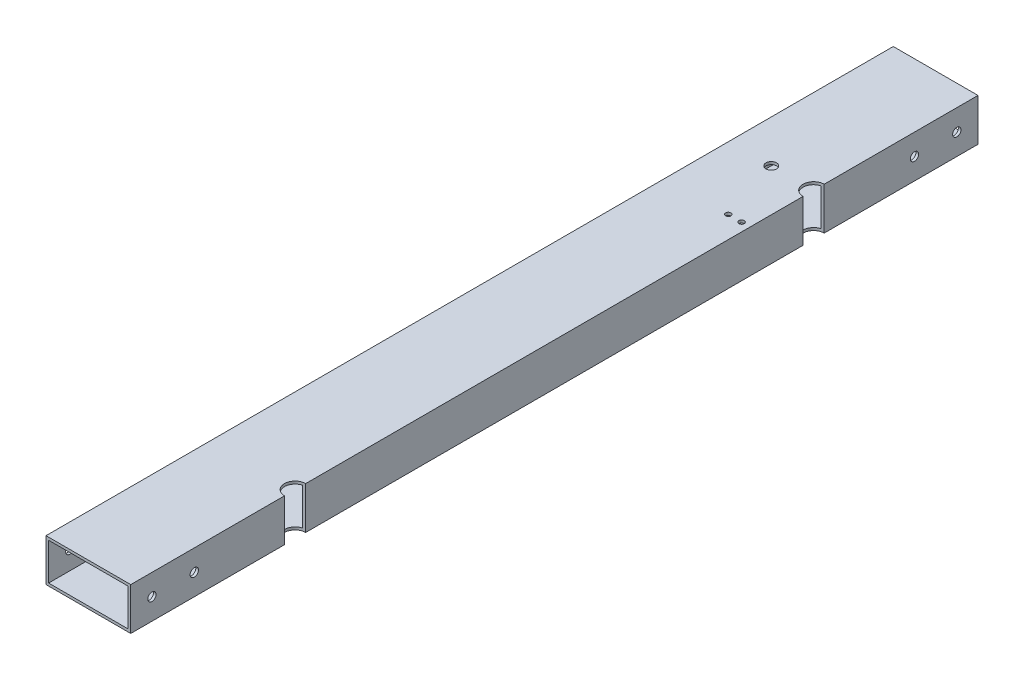
ISO-10303-21;
HEADER;
FILE_DESCRIPTION(('STEP AP214'),'2;1');
FILE_NAME('part.step','',(''),(''),'','','');
FILE_SCHEMA(('AUTOMOTIVE_DESIGN { 1 0 10303 214 1 1 1 1 }'));
ENDSEC;
DATA;
#1=APPLICATION_CONTEXT('core data for automotive mechanical design processes');
#2=APPLICATION_PROTOCOL_DEFINITION('international standard','automotive_design',2000,#1);
#3=PRODUCT_CONTEXT('',#1,'mechanical');
#4=PRODUCT('Part','Part','',(#3));
#5=PRODUCT_RELATED_PRODUCT_CATEGORY('part','',(#4));
#6=PRODUCT_DEFINITION_FORMATION('','',#4);
#7=PRODUCT_DEFINITION_CONTEXT('part definition',#1,'design');
#8=PRODUCT_DEFINITION('design','',#6,#7);
#9=PRODUCT_DEFINITION_SHAPE('','',#8);
#10=(LENGTH_UNIT() NAMED_UNIT(*) SI_UNIT(.MILLI.,.METRE.));
#11=(NAMED_UNIT(*) PLANE_ANGLE_UNIT() SI_UNIT($,.RADIAN.));
#12=(NAMED_UNIT(*) SI_UNIT($,.STERADIAN.) SOLID_ANGLE_UNIT());
#13=UNCERTAINTY_MEASURE_WITH_UNIT(LENGTH_MEASURE(1.E-05),#10,'distance_accuracy_value','');
#14=(GEOMETRIC_REPRESENTATION_CONTEXT(3) GLOBAL_UNCERTAINTY_ASSIGNED_CONTEXT((#13)) GLOBAL_UNIT_ASSIGNED_CONTEXT((#10,
#11,#12)) REPRESENTATION_CONTEXT('',''));
#15=CARTESIAN_POINT('',(0.,0.,0.));
#16=DIRECTION('',(0.,0.,1.));
#17=DIRECTION('',(1.,0.,0.));
#18=AXIS2_PLACEMENT_3D('',#15,#16,#17);
#19=CARTESIAN_POINT('',(25.4,-12.7,254.000000508));
#20=DIRECTION('',(-1.,0.,0.));
#21=DIRECTION('',(0.,0.,1.));
#22=AXIS2_PLACEMENT_3D('',#19,#20,#21);
#23=PLANE('',#22);
#24=CARTESIAN_POINT('',(25.4,1.33226762955019E-12,215.900000508));
#25=DIRECTION('',(1.,0.,0.));
#26=DIRECTION('',(0.,0.,-1.));
#27=AXIS2_PLACEMENT_3D('',#24,#25,#26);
#28=CIRCLE('',#27,2.48919999999999);
#29=CARTESIAN_POINT('',(25.4,1.33226762955019E-12,213.410800508));
#30=VERTEX_POINT('',#29);
#31=EDGE_CURVE('E278',#30,#30,#28,.T.);
#32=ORIENTED_EDGE('',*,*,#31,.F.);
#33=EDGE_LOOP('',(#32));
#34=FACE_BOUND('',#33,.T.);
#35=CARTESIAN_POINT('',(25.4,3.77475828372553E-12,241.300000508));
#36=DIRECTION('',(1.,0.,0.));
#37=DIRECTION('',(0.,0.,-1.));
#38=AXIS2_PLACEMENT_3D('',#35,#36,#37);
#39=CIRCLE('',#38,2.48919999999999);
#40=CARTESIAN_POINT('',(25.4,3.77475828372553E-12,238.810800508));
#41=VERTEX_POINT('',#40);
#42=EDGE_CURVE('E294',#41,#41,#39,.T.);
#43=ORIENTED_EDGE('',*,*,#42,.F.);
#44=EDGE_LOOP('',(#43));
#45=FACE_BOUND('',#44,.T.);
#46=DIRECTION('',(0.,0.,-1.));
#47=VECTOR('',#46,1.);
#48=CARTESIAN_POINT('',(25.4,-12.7,254.000000508));
#49=LINE('',#48,#47);
#50=CARTESIAN_POINT('',(25.4,-12.7,254.000000508));
#51=VERTEX_POINT('',#50);
#52=CARTESIAN_POINT('',(25.4,-12.7,161.798000508));
#53=VERTEX_POINT('',#52);
#54=EDGE_CURVE('E186',#51,#53,#49,.T.);
#55=ORIENTED_EDGE('',*,*,#54,.T.);
#56=DIRECTION('',(0.,1.,0.));
#57=VECTOR('',#56,1.);
#58=CARTESIAN_POINT('',(25.4,-12.7,161.798000508));
#59=LINE('',#58,#57);
#60=CARTESIAN_POINT('',(25.4,12.7,161.798000508));
#61=VERTEX_POINT('',#60);
#62=EDGE_CURVE('E275',#53,#61,#59,.T.);
#63=ORIENTED_EDGE('',*,*,#62,.T.);
#64=DIRECTION('',(0.,0.,-1.));
#65=VECTOR('',#64,1.);
#66=CARTESIAN_POINT('',(25.4,12.7,254.000000508));
#67=LINE('',#66,#65);
#68=CARTESIAN_POINT('',(25.4,12.7,254.000000508));
#69=VERTEX_POINT('',#68);
#70=EDGE_CURVE('E184',#69,#61,#67,.T.);
#71=ORIENTED_EDGE('',*,*,#70,.F.);
#72=DIRECTION('',(0.,1.,0.));
#73=VECTOR('',#72,1.);
#74=CARTESIAN_POINT('',(25.4,-12.7,254.000000508));
#75=LINE('',#74,#73);
#76=EDGE_CURVE('E397',#51,#69,#75,.T.);
#77=ORIENTED_EDGE('',*,*,#76,.F.);
#78=EDGE_LOOP('',(#55,#63,#71,#77));
#79=FACE_BOUND('',#78,.T.);
#80=ADVANCED_FACE('F43',(#34,#45,#79),#23,.F.);
#81=CARTESIAN_POINT('',(25.4,12.7,149.098000508));
#82=VERTEX_POINT('',#81);
#83=CARTESIAN_POINT('',(25.4,12.7,-149.098000508));
#84=VERTEX_POINT('',#83);
#85=EDGE_CURVE('E190',#82,#84,#67,.T.);
#86=ORIENTED_EDGE('',*,*,#85,.F.);
#87=DIRECTION('',(0.,1.,0.));
#88=VECTOR('',#87,1.);
#89=CARTESIAN_POINT('',(25.4,-12.7,149.098000508));
#90=LINE('',#89,#88);
#91=CARTESIAN_POINT('',(25.4,-12.7,149.098000508));
#92=VERTEX_POINT('',#91);
#93=EDGE_CURVE('E69',#82,#92,#90,.F.);
#94=ORIENTED_EDGE('',*,*,#93,.T.);
#95=CARTESIAN_POINT('',(25.4,-12.7,-149.098000508));
#96=VERTEX_POINT('',#95);
#97=EDGE_CURVE('E183',#92,#96,#49,.T.);
#98=ORIENTED_EDGE('',*,*,#97,.T.);
#99=DIRECTION('',(0.,1.,0.));
#100=VECTOR('',#99,1.);
#101=CARTESIAN_POINT('',(25.4,-12.7,-149.098000508));
#102=LINE('',#101,#100);
#103=EDGE_CURVE('E159',#96,#84,#102,.T.);
#104=ORIENTED_EDGE('',*,*,#103,.T.);
#105=EDGE_LOOP('',(#86,#94,#98,#104));
#106=FACE_BOUND('',#105,.T.);
#107=ADVANCED_FACE('F416',(#106),#23,.F.);
#108=CARTESIAN_POINT('',(23.8125,-11.1125,254.000000508));
#109=DIRECTION('',(-1.,0.,0.));
#110=DIRECTION('',(0.,0.,1.));
#111=AXIS2_PLACEMENT_3D('',#108,#109,#110);
#112=PLANE('',#111);
#113=DIRECTION('',(0.,1.,0.));
#114=VECTOR('',#113,1.);
#115=CARTESIAN_POINT('',(23.8125,-12.7,161.596361570104));
#116=LINE('',#115,#114);
#117=CARTESIAN_POINT('',(23.8125,-11.1125,161.596361570104));
#118=VERTEX_POINT('',#117);
#119=CARTESIAN_POINT('',(23.8125,11.1125,161.596361570104));
#120=VERTEX_POINT('',#119);
#121=EDGE_CURVE('E267',#118,#120,#116,.T.);
#122=ORIENTED_EDGE('',*,*,#121,.F.);
#123=DIRECTION('',(0.,0.,-1.));
#124=VECTOR('',#123,1.);
#125=CARTESIAN_POINT('',(23.8125,-11.1125,254.000000508));
#126=LINE('',#125,#124);
#127=CARTESIAN_POINT('',(23.8125,-11.1125,254.000000508));
#128=VERTEX_POINT('',#127);
#129=EDGE_CURVE('E382',#128,#118,#126,.T.);
#130=ORIENTED_EDGE('',*,*,#129,.F.);
#131=DIRECTION('',(0.,1.,0.));
#132=VECTOR('',#131,1.);
#133=CARTESIAN_POINT('',(23.8125,-11.1125,254.000000508));
#134=LINE('',#133,#132);
#135=CARTESIAN_POINT('',(23.8125,11.1125,254.000000508));
#136=VERTEX_POINT('',#135);
#137=EDGE_CURVE('E365',#128,#136,#134,.T.);
#138=ORIENTED_EDGE('',*,*,#137,.T.);
#139=DIRECTION('',(0.,0.,-1.));
#140=VECTOR('',#139,1.);
#141=CARTESIAN_POINT('',(23.8125,11.1125,254.000000508));
#142=LINE('',#141,#140);
#143=EDGE_CURVE('E376',#136,#120,#142,.T.);
#144=ORIENTED_EDGE('',*,*,#143,.T.);
#145=EDGE_LOOP('',(#122,#130,#138,#144));
#146=FACE_BOUND('',#145,.T.);
#147=CARTESIAN_POINT('',(23.8125,3.77475828372553E-12,241.300000508));
#148=DIRECTION('',(-1.,0.,0.));
#149=DIRECTION('',(0.,0.,1.));
#150=AXIS2_PLACEMENT_3D('',#147,#148,#149);
#151=CIRCLE('',#150,2.48919999999999);
#152=CARTESIAN_POINT('',(23.8125,3.77475828372553E-12,243.789200508));
#153=VERTEX_POINT('',#152);
#154=EDGE_CURVE('E302',#153,#153,#151,.T.);
#155=ORIENTED_EDGE('',*,*,#154,.F.);
#156=EDGE_LOOP('',(#155));
#157=FACE_BOUND('',#156,.T.);
#158=CARTESIAN_POINT('',(23.8125,1.33226762955019E-12,215.900000508));
#159=DIRECTION('',(-1.,0.,0.));
#160=DIRECTION('',(0.,0.,1.));
#161=AXIS2_PLACEMENT_3D('',#158,#159,#160);
#162=CIRCLE('',#161,2.48919999999999);
#163=CARTESIAN_POINT('',(23.8125,1.33226762955019E-12,218.389200508));
#164=VERTEX_POINT('',#163);
#165=EDGE_CURVE('E290',#164,#164,#162,.T.);
#166=ORIENTED_EDGE('',*,*,#165,.F.);
#167=EDGE_LOOP('',(#166));
#168=FACE_BOUND('',#167,.T.);
#169=ADVANCED_FACE('F447',(#146,#157,#168),#112,.T.);
#170=DIRECTION('',(0.,1.,0.));
#171=VECTOR('',#170,1.);
#172=CARTESIAN_POINT('',(23.8125,-12.7,149.299639445896));
#173=LINE('',#172,#171);
#174=CARTESIAN_POINT('',(23.8125,11.1125,149.299639445896));
#175=VERTEX_POINT('',#174);
#176=CARTESIAN_POINT('',(23.8125,-11.1125,149.299639445896));
#177=VERTEX_POINT('',#176);
#178=EDGE_CURVE('E264',#175,#177,#173,.F.);
#179=ORIENTED_EDGE('',*,*,#178,.F.);
#180=CARTESIAN_POINT('',(23.8125,11.1125,-149.299639445896));
#181=VERTEX_POINT('',#180);
#182=EDGE_CURVE('E381',#175,#181,#142,.T.);
#183=ORIENTED_EDGE('',*,*,#182,.T.);
#184=DIRECTION('',(0.,1.,0.));
#185=VECTOR('',#184,1.);
#186=CARTESIAN_POINT('',(23.8125,-12.7,-149.299639445896));
#187=LINE('',#186,#185);
#188=CARTESIAN_POINT('',(23.8125,-11.1125,-149.299639445896));
#189=VERTEX_POINT('',#188);
#190=EDGE_CURVE('E257',#189,#181,#187,.T.);
#191=ORIENTED_EDGE('',*,*,#190,.F.);
#192=EDGE_CURVE('E387',#177,#189,#126,.T.);
#193=ORIENTED_EDGE('',*,*,#192,.F.);
#194=EDGE_LOOP('',(#179,#183,#191,#193));
#195=FACE_BOUND('',#194,.T.);
#196=ADVANCED_FACE('F541',(#195),#112,.T.);
#197=CARTESIAN_POINT('',(0.,0.,254.000000508));
#198=DIRECTION('',(0.,0.,1.));
#199=DIRECTION('',(1.,0.,0.));
#200=AXIS2_PLACEMENT_3D('',#197,#198,#199);
#201=PLANE('',#200);
#202=DIRECTION('',(0.,-1.,0.));
#203=VECTOR('',#202,1.);
#204=CARTESIAN_POINT('',(-25.4,12.7,254.000000508));
#205=LINE('',#204,#203);
#206=CARTESIAN_POINT('',(-25.4,12.7,254.000000508));
#207=VERTEX_POINT('',#206);
#208=CARTESIAN_POINT('',(-25.4,-12.7,254.000000508));
#209=VERTEX_POINT('',#208);
#210=EDGE_CURVE('E390',#207,#209,#205,.T.);
#211=ORIENTED_EDGE('',*,*,#210,.T.);
#212=DIRECTION('',(1.,0.,0.));
#213=VECTOR('',#212,1.);
#214=CARTESIAN_POINT('',(-25.4,-12.7,254.000000508));
#215=LINE('',#214,#213);
#216=EDGE_CURVE('E394',#209,#51,#215,.T.);
#217=ORIENTED_EDGE('',*,*,#216,.T.);
#218=ORIENTED_EDGE('',*,*,#76,.T.);
#219=DIRECTION('',(-1.,0.,0.));
#220=VECTOR('',#219,1.);
#221=CARTESIAN_POINT('',(25.4,12.7,254.000000508));
#222=LINE('',#221,#220);
#223=EDGE_CURVE('E400',#69,#207,#222,.T.);
#224=ORIENTED_EDGE('',*,*,#223,.T.);
#225=EDGE_LOOP('',(#211,#217,#218,#224));
#226=FACE_BOUND('',#225,.T.);
#227=DIRECTION('',(1.,0.,0.));
#228=VECTOR('',#227,1.);
#229=CARTESIAN_POINT('',(-23.8125,-11.1125,254.000000508));
#230=LINE('',#229,#228);
#231=CARTESIAN_POINT('',(-23.8125,-11.1125,254.000000508));
#232=VERTEX_POINT('',#231);
#233=EDGE_CURVE('E362',#232,#128,#230,.T.);
#234=ORIENTED_EDGE('',*,*,#233,.F.);
#235=DIRECTION('',(0.,-1.,0.));
#236=VECTOR('',#235,1.);
#237=CARTESIAN_POINT('',(-23.8125,11.1125,254.000000508));
#238=LINE('',#237,#236);
#239=CARTESIAN_POINT('',(-23.8125,11.1125,254.000000508));
#240=VERTEX_POINT('',#239);
#241=EDGE_CURVE('E359',#240,#232,#238,.T.);
#242=ORIENTED_EDGE('',*,*,#241,.F.);
#243=DIRECTION('',(-1.,0.,0.));
#244=VECTOR('',#243,1.);
#245=CARTESIAN_POINT('',(23.8125,11.1125,254.000000508));
#246=LINE('',#245,#244);
#247=EDGE_CURVE('E369',#136,#240,#246,.T.);
#248=ORIENTED_EDGE('',*,*,#247,.F.);
#249=ORIENTED_EDGE('',*,*,#137,.F.);
#250=EDGE_LOOP('',(#234,#242,#248,#249));
#251=FACE_BOUND('',#250,.T.);
#252=ADVANCED_FACE('F421',(#226,#251),#201,.T.);
#253=CARTESIAN_POINT('',(-25.4,12.7,254.000000508));
#254=DIRECTION('',(1.,0.,0.));
#255=DIRECTION('',(0.,0.,-1.));
#256=AXIS2_PLACEMENT_3D('',#253,#254,#255);
#257=PLANE('',#256);
#258=CARTESIAN_POINT('',(-25.4,1.33226762955019E-12,215.900000508));
#259=DIRECTION('',(1.,0.,0.));
#260=DIRECTION('',(0.,0.,-1.));
#261=AXIS2_PLACEMENT_3D('',#258,#259,#260);
#262=CIRCLE('',#261,2.48919999999999);
#263=CARTESIAN_POINT('',(-25.4,1.33226762955019E-12,213.410800508));
#264=VERTEX_POINT('',#263);
#265=EDGE_CURVE('E282',#264,#264,#262,.T.);
#266=ORIENTED_EDGE('',*,*,#265,.T.);
#267=EDGE_LOOP('',(#266));
#268=FACE_BOUND('',#267,.T.);
#269=CARTESIAN_POINT('',(-25.4,3.77475828372553E-12,241.300000508));
#270=DIRECTION('',(1.,0.,0.));
#271=DIRECTION('',(0.,0.,-1.));
#272=AXIS2_PLACEMENT_3D('',#269,#270,#271);
#273=CIRCLE('',#272,2.48919999999999);
#274=CARTESIAN_POINT('',(-25.4,3.77475828372553E-12,238.810800508));
#275=VERTEX_POINT('',#274);
#276=EDGE_CURVE('E298',#275,#275,#273,.T.);
#277=ORIENTED_EDGE('',*,*,#276,.T.);
#278=EDGE_LOOP('',(#277));
#279=FACE_BOUND('',#278,.T.);
#280=CARTESIAN_POINT('',(-25.4,-6.13745165800594E-12,-215.899999492001));
#281=DIRECTION('',(1.,0.,0.));
#282=DIRECTION('',(0.,0.,-1.));
#283=AXIS2_PLACEMENT_3D('',#280,#281,#282);
#284=CIRCLE('',#283,2.48919999999999);
#285=CARTESIAN_POINT('',(-25.4,-6.13745165800594E-12,-218.389199492001));
#286=VERTEX_POINT('',#285);
#287=EDGE_CURVE('E215',#286,#286,#284,.T.);
#288=ORIENTED_EDGE('',*,*,#287,.T.);
#289=EDGE_LOOP('',(#288));
#290=FACE_BOUND('',#289,.T.);
#291=CARTESIAN_POINT('',(-25.4,-6.13720771251713E-12,-241.299999492001));
#292=DIRECTION('',(1.,0.,0.));
#293=DIRECTION('',(0.,0.,-1.));
#294=AXIS2_PLACEMENT_3D('',#291,#292,#293);
#295=CIRCLE('',#294,2.48919999999999);
#296=CARTESIAN_POINT('',(-25.4,-6.13720771251713E-12,-243.789199492001));
#297=VERTEX_POINT('',#296);
#298=EDGE_CURVE('E210',#297,#297,#295,.T.);
#299=ORIENTED_EDGE('',*,*,#298,.T.);
#300=EDGE_LOOP('',(#299));
#301=FACE_BOUND('',#300,.T.);
#302=DIRECTION('',(0.,0.,-1.));
#303=VECTOR('',#302,1.);
#304=CARTESIAN_POINT('',(-25.4,12.7,254.000000508));
#305=LINE('',#304,#303);
#306=CARTESIAN_POINT('',(-25.4,12.7,-254.000000508));
#307=VERTEX_POINT('',#306);
#308=EDGE_CURVE('E403',#207,#307,#305,.T.);
#309=ORIENTED_EDGE('',*,*,#308,.T.);
#310=DIRECTION('',(0.,-1.,0.));
#311=VECTOR('',#310,1.);
#312=CARTESIAN_POINT('',(-25.4,12.7,-254.000000508));
#313=LINE('',#312,#311);
#314=CARTESIAN_POINT('',(-25.4,-12.7,-254.000000508));
#315=VERTEX_POINT('',#314);
#316=EDGE_CURVE('E346',#307,#315,#313,.T.);
#317=ORIENTED_EDGE('',*,*,#316,.T.);
#318=DIRECTION('',(0.,0.,-1.));
#319=VECTOR('',#318,1.);
#320=CARTESIAN_POINT('',(-25.4,-12.7,254.000000508));
#321=LINE('',#320,#319);
#322=EDGE_CURVE('E195',#209,#315,#321,.T.);
#323=ORIENTED_EDGE('',*,*,#322,.F.);
#324=ORIENTED_EDGE('',*,*,#210,.F.);
#325=EDGE_LOOP('',(#309,#317,#323,#324));
#326=FACE_BOUND('',#325,.T.);
#327=ADVANCED_FACE('F45',(#268,#279,#290,#301,#326),#257,.F.);
#328=CARTESIAN_POINT('',(-25.4,-12.7,254.000000508));
#329=DIRECTION('',(0.,1.,0.));
#330=DIRECTION('',(-1.,0.,0.));
#331=AXIS2_PLACEMENT_3D('',#328,#329,#330);
#332=PLANE('',#331);
#333=CARTESIAN_POINT('',(20.32,-12.7,-117.348000508));
#334=DIRECTION('',(0.,1.,0.));
#335=DIRECTION('',(0.,0.,1.));
#336=AXIS2_PLACEMENT_3D('',#333,#334,#335);
#337=CIRCLE('',#336,1.6);
#338=CARTESIAN_POINT('',(20.32,-12.7,-115.748000508));
#339=VERTEX_POINT('',#338);
#340=EDGE_CURVE('E515',#339,#339,#337,.T.);
#341=ORIENTED_EDGE('',*,*,#340,.T.);
#342=EDGE_LOOP('',(#341));
#343=FACE_BOUND('',#342,.T.);
#344=CARTESIAN_POINT('',(12.32,-12.7,-117.348000508));
#345=DIRECTION('',(0.,1.,0.));
#346=DIRECTION('',(0.,0.,1.));
#347=AXIS2_PLACEMENT_3D('',#344,#345,#346);
#348=CIRCLE('',#347,1.6);
#349=CARTESIAN_POINT('',(12.32,-12.7,-115.748000508));
#350=VERTEX_POINT('',#349);
#351=EDGE_CURVE('E224',#350,#350,#348,.T.);
#352=ORIENTED_EDGE('',*,*,#351,.T.);
#353=EDGE_LOOP('',(#352));
#354=FACE_BOUND('',#353,.T.);
#355=ORIENTED_EDGE('',*,*,#97,.F.);
#356=CARTESIAN_POINT('',(25.4,-12.7,155.448000508));
#357=DIRECTION('',(0.,1.,0.));
#358=DIRECTION('',(-1.,0.,0.));
#359=AXIS2_PLACEMENT_3D('',#356,#357,#358);
#360=CIRCLE('',#359,6.35);
#361=EDGE_CURVE('E245',#92,#53,#360,.T.);
#362=ORIENTED_EDGE('',*,*,#361,.T.);
#363=ORIENTED_EDGE('',*,*,#54,.F.);
#364=ORIENTED_EDGE('',*,*,#216,.F.);
#365=ORIENTED_EDGE('',*,*,#322,.T.);
#366=DIRECTION('',(1.,0.,0.));
#367=VECTOR('',#366,1.);
#368=CARTESIAN_POINT('',(-25.4,-12.7,-254.000000508));
#369=LINE('',#368,#367);
#370=CARTESIAN_POINT('',(25.4,-12.7,-254.000000508));
#371=VERTEX_POINT('',#370);
#372=EDGE_CURVE('E181',#315,#371,#369,.T.);
#373=ORIENTED_EDGE('',*,*,#372,.T.);
#374=CARTESIAN_POINT('',(25.4,-12.7,-161.798000508));
#375=VERTEX_POINT('',#374);
#376=EDGE_CURVE('E172',#375,#371,#49,.T.);
#377=ORIENTED_EDGE('',*,*,#376,.F.);
#378=CARTESIAN_POINT('',(25.4,-12.7,-155.448000508));
#379=DIRECTION('',(0.,1.,0.));
#380=DIRECTION('',(1.,0.,0.));
#381=AXIS2_PLACEMENT_3D('',#378,#379,#380);
#382=CIRCLE('',#381,6.35);
#383=EDGE_CURVE('E156',#375,#96,#382,.T.);
#384=ORIENTED_EDGE('',*,*,#383,.T.);
#385=EDGE_LOOP('',(#355,#362,#363,#364,#365,#373,#377,#384));
#386=FACE_BOUND('',#385,.T.);
#387=ADVANCED_FACE('F179',(#343,#354,#386),#332,.F.);
#388=CARTESIAN_POINT('',(25.4,-6.13745165800594E-12,-215.899999492001));
#389=DIRECTION('',(1.,0.,0.));
#390=DIRECTION('',(0.,0.,-1.));
#391=AXIS2_PLACEMENT_3D('',#388,#389,#390);
#392=CIRCLE('',#391,2.48919999999999);
#393=CARTESIAN_POINT('',(25.4,-6.13745165800594E-12,-218.389199492001));
#394=VERTEX_POINT('',#393);
#395=EDGE_CURVE('E310',#394,#394,#392,.T.);
#396=ORIENTED_EDGE('',*,*,#395,.F.);
#397=EDGE_LOOP('',(#396));
#398=FACE_BOUND('',#397,.T.);
#399=CARTESIAN_POINT('',(25.4,-6.13720771251713E-12,-241.299999492001));
#400=DIRECTION('',(1.,0.,0.));
#401=DIRECTION('',(0.,0.,-1.));
#402=AXIS2_PLACEMENT_3D('',#399,#400,#401);
#403=CIRCLE('',#402,2.48919999999999);
#404=CARTESIAN_POINT('',(25.4,-6.13720771251713E-12,-243.789199492001));
#405=VERTEX_POINT('',#404);
#406=EDGE_CURVE('E320',#405,#405,#403,.T.);
#407=ORIENTED_EDGE('',*,*,#406,.F.);
#408=EDGE_LOOP('',(#407));
#409=FACE_BOUND('',#408,.T.);
#410=CARTESIAN_POINT('',(25.4,12.7,-161.798000508));
#411=VERTEX_POINT('',#410);
#412=CARTESIAN_POINT('',(25.4,12.7,-254.000000508));
#413=VERTEX_POINT('',#412);
#414=EDGE_CURVE('E174',#411,#413,#67,.T.);
#415=ORIENTED_EDGE('',*,*,#414,.F.);
#416=DIRECTION('',(0.,1.,0.));
#417=VECTOR('',#416,1.);
#418=CARTESIAN_POINT('',(25.4,-12.7,-161.798000508));
#419=LINE('',#418,#417);
#420=EDGE_CURVE('E61',#411,#375,#419,.F.);
#421=ORIENTED_EDGE('',*,*,#420,.T.);
#422=ORIENTED_EDGE('',*,*,#376,.T.);
#423=DIRECTION('',(0.,1.,0.));
#424=VECTOR('',#423,1.);
#425=CARTESIAN_POINT('',(25.4,-12.7,-254.000000508));
#426=LINE('',#425,#424);
#427=EDGE_CURVE('E352',#371,#413,#426,.T.);
#428=ORIENTED_EDGE('',*,*,#427,.T.);
#429=EDGE_LOOP('',(#415,#421,#422,#428));
#430=FACE_BOUND('',#429,.T.);
#431=ADVANCED_FACE('F170',(#398,#409,#430),#23,.F.);
#432=CARTESIAN_POINT('',(25.4,12.7,254.000000508));
#433=DIRECTION('',(0.,-1.,0.));
#434=DIRECTION('',(1.,0.,0.));
#435=AXIS2_PLACEMENT_3D('',#432,#433,#434);
#436=PLANE('',#435);
#437=CARTESIAN_POINT('',(20.32,12.7,-117.348000508));
#438=DIRECTION('',(0.,1.,0.));
#439=DIRECTION('',(0.,0.,1.));
#440=AXIS2_PLACEMENT_3D('',#437,#438,#439);
#441=CIRCLE('',#440,1.59999999999999);
#442=CARTESIAN_POINT('',(20.32,12.7,-115.748000508));
#443=VERTEX_POINT('',#442);
#444=EDGE_CURVE('E513',#443,#443,#441,.T.);
#445=ORIENTED_EDGE('',*,*,#444,.F.);
#446=EDGE_LOOP('',(#445));
#447=FACE_BOUND('',#446,.T.);
#448=CARTESIAN_POINT('',(12.32,12.7,-117.348000508));
#449=DIRECTION('',(0.,1.,0.));
#450=DIRECTION('',(0.,0.,1.));
#451=AXIS2_PLACEMENT_3D('',#448,#449,#450);
#452=CIRCLE('',#451,1.59999999999999);
#453=CARTESIAN_POINT('',(12.32,12.7,-115.748000508));
#454=VERTEX_POINT('',#453);
#455=EDGE_CURVE('E232',#454,#454,#452,.T.);
#456=ORIENTED_EDGE('',*,*,#455,.F.);
#457=EDGE_LOOP('',(#456));
#458=FACE_BOUND('',#457,.T.);
#459=CARTESIAN_POINT('',(0.,12.7,-155.448000508));
#460=DIRECTION('',(0.,1.,0.));
#461=DIRECTION('',(0.,0.,1.));
#462=AXIS2_PLACEMENT_3D('',#459,#460,#461);
#463=CIRCLE('',#462,3.17499999999999);
#464=CARTESIAN_POINT('',(0.,12.7,-152.273000508));
#465=VERTEX_POINT('',#464);
#466=EDGE_CURVE('E219',#465,#465,#463,.T.);
#467=ORIENTED_EDGE('',*,*,#466,.F.);
#468=EDGE_LOOP('',(#467));
#469=FACE_BOUND('',#468,.T.);
#470=ORIENTED_EDGE('',*,*,#70,.T.);
#471=CARTESIAN_POINT('',(25.4,12.7,155.448000508));
#472=DIRECTION('',(0.,1.,0.));
#473=DIRECTION('',(-1.,0.,0.));
#474=AXIS2_PLACEMENT_3D('',#471,#472,#473);
#475=CIRCLE('',#474,6.35);
#476=EDGE_CURVE('E250',#82,#61,#475,.T.);
#477=ORIENTED_EDGE('',*,*,#476,.F.);
#478=ORIENTED_EDGE('',*,*,#85,.T.);
#479=CARTESIAN_POINT('',(25.4,12.7,-155.448000508));
#480=DIRECTION('',(0.,1.,0.));
#481=DIRECTION('',(1.,0.,0.));
#482=AXIS2_PLACEMENT_3D('',#479,#480,#481);
#483=CIRCLE('',#482,6.35);
#484=EDGE_CURVE('E165',#411,#84,#483,.T.);
#485=ORIENTED_EDGE('',*,*,#484,.F.);
#486=ORIENTED_EDGE('',*,*,#414,.T.);
#487=DIRECTION('',(-1.,0.,0.));
#488=VECTOR('',#487,1.);
#489=CARTESIAN_POINT('',(25.4,12.7,-254.000000508));
#490=LINE('',#489,#488);
#491=EDGE_CURVE('E355',#413,#307,#490,.T.);
#492=ORIENTED_EDGE('',*,*,#491,.T.);
#493=ORIENTED_EDGE('',*,*,#308,.F.);
#494=ORIENTED_EDGE('',*,*,#223,.F.);
#495=EDGE_LOOP('',(#470,#477,#478,#485,#486,#492,#493,#494));
#496=FACE_BOUND('',#495,.T.);
#497=ADVANCED_FACE('F414',(#447,#458,#469,#496),#436,.F.);
#498=CARTESIAN_POINT('',(-23.8125,11.1125,254.000000508));
#499=DIRECTION('',(1.,0.,0.));
#500=DIRECTION('',(0.,1.,0.));
#501=AXIS2_PLACEMENT_3D('',#498,#499,#500);
#502=PLANE('',#501);
#503=CARTESIAN_POINT('',(-23.8125,1.33226762955019E-12,215.900000508));
#504=DIRECTION('',(1.,0.,0.));
#505=DIRECTION('',(0.,1.,0.));
#506=AXIS2_PLACEMENT_3D('',#503,#504,#505);
#507=CIRCLE('',#506,2.48919999999999);
#508=CARTESIAN_POINT('',(-23.8125,2.48920000000132,215.900000508));
#509=VERTEX_POINT('',#508);
#510=EDGE_CURVE('E286',#509,#509,#507,.T.);
#511=ORIENTED_EDGE('',*,*,#510,.F.);
#512=EDGE_LOOP('',(#511));
#513=FACE_BOUND('',#512,.T.);
#514=CARTESIAN_POINT('',(-23.8125,3.77475828372553E-12,241.300000508));
#515=DIRECTION('',(1.,0.,0.));
#516=DIRECTION('',(0.,1.,0.));
#517=AXIS2_PLACEMENT_3D('',#514,#515,#516);
#518=CIRCLE('',#517,2.48919999999999);
#519=CARTESIAN_POINT('',(-23.8125,2.48920000000377,241.300000508));
#520=VERTEX_POINT('',#519);
#521=EDGE_CURVE('E306',#520,#520,#518,.T.);
#522=ORIENTED_EDGE('',*,*,#521,.F.);
#523=EDGE_LOOP('',(#522));
#524=FACE_BOUND('',#523,.T.);
#525=CARTESIAN_POINT('',(-23.8125,-6.13745165800594E-12,-215.899999492001));
#526=DIRECTION('',(1.,0.,0.));
#527=DIRECTION('',(0.,1.,0.));
#528=AXIS2_PLACEMENT_3D('',#525,#526,#527);
#529=CIRCLE('',#528,2.48919999999999);
#530=CARTESIAN_POINT('',(-23.8125,2.48919999999385,-215.899999492001));
#531=VERTEX_POINT('',#530);
#532=EDGE_CURVE('E214',#531,#531,#529,.T.);
#533=ORIENTED_EDGE('',*,*,#532,.F.);
#534=EDGE_LOOP('',(#533));
#535=FACE_BOUND('',#534,.T.);
#536=CARTESIAN_POINT('',(-23.8125,-6.13720771251713E-12,-241.299999492001));
#537=DIRECTION('',(1.,0.,0.));
#538=DIRECTION('',(0.,1.,0.));
#539=AXIS2_PLACEMENT_3D('',#536,#537,#538);
#540=CIRCLE('',#539,2.48919999999999);
#541=CARTESIAN_POINT('',(-23.8125,2.48919999999385,-241.299999492001));
#542=VERTEX_POINT('',#541);
#543=EDGE_CURVE('E205',#542,#542,#540,.T.);
#544=ORIENTED_EDGE('',*,*,#543,.F.);
#545=EDGE_LOOP('',(#544));
#546=FACE_BOUND('',#545,.T.);
#547=DIRECTION('',(0.,0.,-1.));
#548=VECTOR('',#547,1.);
#549=CARTESIAN_POINT('',(-23.8125,-11.1125,254.000000508));
#550=LINE('',#549,#548);
#551=CARTESIAN_POINT('',(-23.8125,-11.1125,-254.000000508));
#552=VERTEX_POINT('',#551);
#553=EDGE_CURVE('E386',#232,#552,#550,.T.);
#554=ORIENTED_EDGE('',*,*,#553,.T.);
#555=DIRECTION('',(0.,-1.,0.));
#556=VECTOR('',#555,1.);
#557=CARTESIAN_POINT('',(-23.8125,11.1125,-254.000000508));
#558=LINE('',#557,#556);
#559=CARTESIAN_POINT('',(-23.8125,11.1125,-254.000000508));
#560=VERTEX_POINT('',#559);
#561=EDGE_CURVE('E330',#560,#552,#558,.T.);
#562=ORIENTED_EDGE('',*,*,#561,.F.);
#563=DIRECTION('',(0.,0.,-1.));
#564=VECTOR('',#563,1.);
#565=CARTESIAN_POINT('',(-23.8125,11.1125,254.000000508));
#566=LINE('',#565,#564);
#567=EDGE_CURVE('E372',#240,#560,#566,.T.);
#568=ORIENTED_EDGE('',*,*,#567,.F.);
#569=ORIENTED_EDGE('',*,*,#241,.T.);
#570=EDGE_LOOP('',(#554,#562,#568,#569));
#571=FACE_BOUND('',#570,.T.);
#572=ADVANCED_FACE('F457',(#513,#524,#535,#546,#571),#502,.T.);
#573=CARTESIAN_POINT('',(-23.8125,-11.1125,254.000000508));
#574=DIRECTION('',(0.,1.,0.));
#575=DIRECTION('',(0.,0.,1.));
#576=AXIS2_PLACEMENT_3D('',#573,#574,#575);
#577=PLANE('',#576);
#578=CARTESIAN_POINT('',(20.32,-11.1125,-117.348000508));
#579=DIRECTION('',(0.,1.,0.));
#580=DIRECTION('',(0.,0.,1.));
#581=AXIS2_PLACEMENT_3D('',#578,#579,#580);
#582=CIRCLE('',#581,1.59999999999999);
#583=CARTESIAN_POINT('',(20.32,-11.1125,-115.748000508));
#584=VERTEX_POINT('',#583);
#585=EDGE_CURVE('E238',#584,#584,#582,.T.);
#586=ORIENTED_EDGE('',*,*,#585,.F.);
#587=EDGE_LOOP('',(#586));
#588=FACE_BOUND('',#587,.T.);
#589=CARTESIAN_POINT('',(12.32,-11.1125,-117.348000508));
#590=DIRECTION('',(0.,1.,0.));
#591=DIRECTION('',(0.,0.,1.));
#592=AXIS2_PLACEMENT_3D('',#589,#590,#591);
#593=CIRCLE('',#592,1.59999999999999);
#594=CARTESIAN_POINT('',(12.32,-11.1125,-115.748000508));
#595=VERTEX_POINT('',#594);
#596=EDGE_CURVE('E223',#595,#595,#593,.T.);
#597=ORIENTED_EDGE('',*,*,#596,.F.);
#598=EDGE_LOOP('',(#597));
#599=FACE_BOUND('',#598,.T.);
#600=CARTESIAN_POINT('',(25.4,-11.1125,155.448000508));
#601=DIRECTION('',(0.,1.,0.));
#602=DIRECTION('',(0.,0.,1.));
#603=AXIS2_PLACEMENT_3D('',#600,#601,#602);
#604=CIRCLE('',#603,6.35);
#605=EDGE_CURVE('E270',#177,#118,#604,.T.);
#606=ORIENTED_EDGE('',*,*,#605,.F.);
#607=ORIENTED_EDGE('',*,*,#192,.T.);
#608=CARTESIAN_POINT('',(25.4,-11.1125,-155.448000508));
#609=DIRECTION('',(0.,1.,0.));
#610=DIRECTION('',(0.,0.,1.));
#611=AXIS2_PLACEMENT_3D('',#608,#609,#610);
#612=CIRCLE('',#611,6.35);
#613=CARTESIAN_POINT('',(23.8125,-11.1125,-161.596361570104));
#614=VERTEX_POINT('',#613);
#615=EDGE_CURVE('E176',#614,#189,#612,.T.);
#616=ORIENTED_EDGE('',*,*,#615,.F.);
#617=CARTESIAN_POINT('',(23.8125,-11.1125,-254.000000508));
#618=VERTEX_POINT('',#617);
#619=EDGE_CURVE('E380',#614,#618,#126,.T.);
#620=ORIENTED_EDGE('',*,*,#619,.T.);
#621=DIRECTION('',(1.,0.,0.));
#622=VECTOR('',#621,1.);
#623=CARTESIAN_POINT('',(-23.8125,-11.1125,-254.000000508));
#624=LINE('',#623,#622);
#625=EDGE_CURVE('E334',#552,#618,#624,.T.);
#626=ORIENTED_EDGE('',*,*,#625,.F.);
#627=ORIENTED_EDGE('',*,*,#553,.F.);
#628=ORIENTED_EDGE('',*,*,#233,.T.);
#629=ORIENTED_EDGE('',*,*,#129,.T.);
#630=EDGE_LOOP('',(#606,#607,#616,#620,#626,#627,#628,#629));
#631=FACE_BOUND('',#630,.T.);
#632=ADVANCED_FACE('F526',(#588,#599,#631),#577,.T.);
#633=DIRECTION('',(0.,1.,0.));
#634=VECTOR('',#633,1.);
#635=CARTESIAN_POINT('',(23.8125,-12.7,-161.596361570104));
#636=LINE('',#635,#634);
#637=CARTESIAN_POINT('',(23.8125,11.1125,-161.596361570104));
#638=VERTEX_POINT('',#637);
#639=EDGE_CURVE('E249',#638,#614,#636,.F.);
#640=ORIENTED_EDGE('',*,*,#639,.F.);
#641=CARTESIAN_POINT('',(23.8125,11.1125,-254.000000508));
#642=VERTEX_POINT('',#641);
#643=EDGE_CURVE('E375',#638,#642,#142,.T.);
#644=ORIENTED_EDGE('',*,*,#643,.T.);
#645=DIRECTION('',(0.,1.,0.));
#646=VECTOR('',#645,1.);
#647=CARTESIAN_POINT('',(23.8125,-11.1125,-254.000000508));
#648=LINE('',#647,#646);
#649=EDGE_CURVE('E338',#618,#642,#648,.T.);
#650=ORIENTED_EDGE('',*,*,#649,.F.);
#651=ORIENTED_EDGE('',*,*,#619,.F.);
#652=EDGE_LOOP('',(#640,#644,#650,#651));
#653=FACE_BOUND('',#652,.T.);
#654=CARTESIAN_POINT('',(23.8125,-6.13745165800594E-12,-215.899999492001));
#655=DIRECTION('',(-1.,0.,0.));
#656=DIRECTION('',(0.,0.,1.));
#657=AXIS2_PLACEMENT_3D('',#654,#655,#656);
#658=CIRCLE('',#657,2.48919999999999);
#659=CARTESIAN_POINT('',(23.8125,-6.13745165800594E-12,-213.410799492001));
#660=VERTEX_POINT('',#659);
#661=EDGE_CURVE('E211',#660,#660,#658,.T.);
#662=ORIENTED_EDGE('',*,*,#661,.F.);
#663=EDGE_LOOP('',(#662));
#664=FACE_BOUND('',#663,.T.);
#665=CARTESIAN_POINT('',(23.8125,-6.13720771251713E-12,-241.299999492001));
#666=DIRECTION('',(-1.,0.,0.));
#667=DIRECTION('',(0.,0.,1.));
#668=AXIS2_PLACEMENT_3D('',#665,#666,#667);
#669=CIRCLE('',#668,2.48919999999999);
#670=CARTESIAN_POINT('',(23.8125,-6.13720771251713E-12,-238.810799492001));
#671=VERTEX_POINT('',#670);
#672=EDGE_CURVE('E209',#671,#671,#669,.T.);
#673=ORIENTED_EDGE('',*,*,#672,.F.);
#674=EDGE_LOOP('',(#673));
#675=FACE_BOUND('',#674,.T.);
#676=ADVANCED_FACE('F438',(#653,#664,#675),#112,.T.);
#677=CARTESIAN_POINT('',(23.8125,11.1125,254.000000508));
#678=DIRECTION('',(0.,-1.,0.));
#679=DIRECTION('',(0.,0.,-1.));
#680=AXIS2_PLACEMENT_3D('',#677,#678,#679);
#681=PLANE('',#680);
#682=CARTESIAN_POINT('',(20.32,11.1125,-117.348000508));
#683=DIRECTION('',(0.,-1.,0.));
#684=DIRECTION('',(0.,0.,-1.));
#685=AXIS2_PLACEMENT_3D('',#682,#683,#684);
#686=CIRCLE('',#685,1.59999999999999);
#687=CARTESIAN_POINT('',(20.32,11.1125,-118.948000508));
#688=VERTEX_POINT('',#687);
#689=EDGE_CURVE('E47',#688,#688,#686,.T.);
#690=ORIENTED_EDGE('',*,*,#689,.F.);
#691=EDGE_LOOP('',(#690));
#692=FACE_BOUND('',#691,.T.);
#693=CARTESIAN_POINT('',(12.32,11.1125,-117.348000508));
#694=DIRECTION('',(0.,-1.,0.));
#695=DIRECTION('',(0.,0.,-1.));
#696=AXIS2_PLACEMENT_3D('',#693,#694,#695);
#697=CIRCLE('',#696,1.59999999999999);
#698=CARTESIAN_POINT('',(12.32,11.1125,-118.948000508));
#699=VERTEX_POINT('',#698);
#700=EDGE_CURVE('E220',#699,#699,#697,.T.);
#701=ORIENTED_EDGE('',*,*,#700,.F.);
#702=EDGE_LOOP('',(#701));
#703=FACE_BOUND('',#702,.T.);
#704=CARTESIAN_POINT('',(0.,11.1125,-155.448000508));
#705=DIRECTION('',(0.,-1.,0.));
#706=DIRECTION('',(0.,0.,-1.));
#707=AXIS2_PLACEMENT_3D('',#704,#705,#706);
#708=CIRCLE('',#707,3.17499999999999);
#709=CARTESIAN_POINT('',(0.,11.1125,-158.623000508));
#710=VERTEX_POINT('',#709);
#711=EDGE_CURVE('E166',#710,#710,#708,.T.);
#712=ORIENTED_EDGE('',*,*,#711,.F.);
#713=EDGE_LOOP('',(#712));
#714=FACE_BOUND('',#713,.T.);
#715=CARTESIAN_POINT('',(25.4,11.1125,155.448000508));
#716=DIRECTION('',(0.,-1.,0.));
#717=DIRECTION('',(0.,0.,-1.));
#718=AXIS2_PLACEMENT_3D('',#715,#716,#717);
#719=CIRCLE('',#718,6.35);
#720=EDGE_CURVE('E11',#120,#175,#719,.T.);
#721=ORIENTED_EDGE('',*,*,#720,.F.);
#722=ORIENTED_EDGE('',*,*,#143,.F.);
#723=ORIENTED_EDGE('',*,*,#247,.T.);
#724=ORIENTED_EDGE('',*,*,#567,.T.);
#725=DIRECTION('',(-1.,0.,0.));
#726=VECTOR('',#725,1.);
#727=CARTESIAN_POINT('',(23.8125,11.1125,-254.000000508));
#728=LINE('',#727,#726);
#729=EDGE_CURVE('E342',#642,#560,#728,.T.);
#730=ORIENTED_EDGE('',*,*,#729,.F.);
#731=ORIENTED_EDGE('',*,*,#643,.F.);
#732=CARTESIAN_POINT('',(25.4,11.1125,-155.448000508));
#733=DIRECTION('',(0.,-1.,0.));
#734=DIRECTION('',(0.,0.,-1.));
#735=AXIS2_PLACEMENT_3D('',#732,#733,#734);
#736=CIRCLE('',#735,6.35);
#737=EDGE_CURVE('E53',#181,#638,#736,.T.);
#738=ORIENTED_EDGE('',*,*,#737,.F.);
#739=ORIENTED_EDGE('',*,*,#182,.F.);
#740=EDGE_LOOP('',(#721,#722,#723,#724,#730,#731,#738,#739));
#741=FACE_BOUND('',#740,.T.);
#742=ADVANCED_FACE('F428',(#692,#703,#714,#741),#681,.T.);
#743=CARTESIAN_POINT('',(0.,0.,-254.000000508));
#744=DIRECTION('',(0.,0.,1.));
#745=DIRECTION('',(1.,0.,0.));
#746=AXIS2_PLACEMENT_3D('',#743,#744,#745);
#747=PLANE('',#746);
#748=ORIENTED_EDGE('',*,*,#729,.T.);
#749=ORIENTED_EDGE('',*,*,#561,.T.);
#750=ORIENTED_EDGE('',*,*,#625,.T.);
#751=ORIENTED_EDGE('',*,*,#649,.T.);
#752=EDGE_LOOP('',(#748,#749,#750,#751));
#753=FACE_BOUND('',#752,.T.);
#754=ORIENTED_EDGE('',*,*,#316,.F.);
#755=ORIENTED_EDGE('',*,*,#491,.F.);
#756=ORIENTED_EDGE('',*,*,#427,.F.);
#757=ORIENTED_EDGE('',*,*,#372,.F.);
#758=EDGE_LOOP('',(#754,#755,#756,#757));
#759=FACE_BOUND('',#758,.T.);
#760=ADVANCED_FACE('F425',(#753,#759),#747,.F.);
#761=CARTESIAN_POINT('',(25.4,-6.13720771251713E-12,-241.299999492001));
#762=DIRECTION('',(1.,0.,0.));
#763=DIRECTION('',(0.,0.,-1.));
#764=AXIS2_PLACEMENT_3D('',#761,#762,#763);
#765=CYLINDRICAL_SURFACE('',#764,2.48919999999999);
#766=ORIENTED_EDGE('',*,*,#543,.T.);
#767=EDGE_LOOP('',(#766));
#768=FACE_BOUND('',#767,.T.);
#769=ORIENTED_EDGE('',*,*,#298,.F.);
#770=EDGE_LOOP('',(#769));
#771=FACE_BOUND('',#770,.T.);
#772=ADVANCED_FACE('F427',(#768,#771),#765,.F.);
#773=ORIENTED_EDGE('',*,*,#672,.T.);
#774=EDGE_LOOP('',(#773));
#775=FACE_BOUND('',#774,.T.);
#776=ORIENTED_EDGE('',*,*,#406,.T.);
#777=EDGE_LOOP('',(#776));
#778=FACE_BOUND('',#777,.T.);
#779=ADVANCED_FACE('F435',(#775,#778),#765,.F.);
#780=CARTESIAN_POINT('',(25.4,-6.13745165800594E-12,-215.899999492001));
#781=DIRECTION('',(1.,0.,0.));
#782=DIRECTION('',(0.,0.,-1.));
#783=AXIS2_PLACEMENT_3D('',#780,#781,#782);
#784=CYLINDRICAL_SURFACE('',#783,2.48919999999999);
#785=ORIENTED_EDGE('',*,*,#661,.T.);
#786=EDGE_LOOP('',(#785));
#787=FACE_BOUND('',#786,.T.);
#788=ORIENTED_EDGE('',*,*,#395,.T.);
#789=EDGE_LOOP('',(#788));
#790=FACE_BOUND('',#789,.T.);
#791=ADVANCED_FACE('F465',(#787,#790),#784,.F.);
#792=ORIENTED_EDGE('',*,*,#532,.T.);
#793=EDGE_LOOP('',(#792));
#794=FACE_BOUND('',#793,.T.);
#795=ORIENTED_EDGE('',*,*,#287,.F.);
#796=EDGE_LOOP('',(#795));
#797=FACE_BOUND('',#796,.T.);
#798=ADVANCED_FACE('F470',(#794,#797),#784,.F.);
#799=CARTESIAN_POINT('',(25.4,3.77475828372553E-12,241.300000508));
#800=DIRECTION('',(1.,0.,0.));
#801=DIRECTION('',(0.,0.,-1.));
#802=AXIS2_PLACEMENT_3D('',#799,#800,#801);
#803=CYLINDRICAL_SURFACE('',#802,2.48919999999999);
#804=ORIENTED_EDGE('',*,*,#154,.T.);
#805=EDGE_LOOP('',(#804));
#806=FACE_BOUND('',#805,.T.);
#807=ORIENTED_EDGE('',*,*,#42,.T.);
#808=EDGE_LOOP('',(#807));
#809=FACE_BOUND('',#808,.T.);
#810=ADVANCED_FACE('F474',(#806,#809),#803,.F.);
#811=ORIENTED_EDGE('',*,*,#521,.T.);
#812=EDGE_LOOP('',(#811));
#813=FACE_BOUND('',#812,.T.);
#814=ORIENTED_EDGE('',*,*,#276,.F.);
#815=EDGE_LOOP('',(#814));
#816=FACE_BOUND('',#815,.T.);
#817=ADVANCED_FACE('F477',(#813,#816),#803,.F.);
#818=CARTESIAN_POINT('',(25.4,1.33226762955019E-12,215.900000508));
#819=DIRECTION('',(1.,0.,0.));
#820=DIRECTION('',(0.,0.,-1.));
#821=AXIS2_PLACEMENT_3D('',#818,#819,#820);
#822=CYLINDRICAL_SURFACE('',#821,2.48919999999999);
#823=ORIENTED_EDGE('',*,*,#165,.T.);
#824=EDGE_LOOP('',(#823));
#825=FACE_BOUND('',#824,.T.);
#826=ORIENTED_EDGE('',*,*,#31,.T.);
#827=EDGE_LOOP('',(#826));
#828=FACE_BOUND('',#827,.T.);
#829=ADVANCED_FACE('F482',(#825,#828),#822,.F.);
#830=ORIENTED_EDGE('',*,*,#510,.T.);
#831=EDGE_LOOP('',(#830));
#832=FACE_BOUND('',#831,.T.);
#833=ORIENTED_EDGE('',*,*,#265,.F.);
#834=EDGE_LOOP('',(#833));
#835=FACE_BOUND('',#834,.T.);
#836=ADVANCED_FACE('F479',(#832,#835),#822,.F.);
#837=CARTESIAN_POINT('',(25.4,-12.7,-155.448000508));
#838=DIRECTION('',(0.,1.,0.));
#839=DIRECTION('',(-1.,0.,0.));
#840=AXIS2_PLACEMENT_3D('',#837,#838,#839);
#841=CYLINDRICAL_SURFACE('',#840,6.35);
#842=ORIENTED_EDGE('',*,*,#615,.T.);
#843=ORIENTED_EDGE('',*,*,#190,.T.);
#844=ORIENTED_EDGE('',*,*,#737,.T.);
#845=ORIENTED_EDGE('',*,*,#639,.T.);
#846=EDGE_LOOP('',(#842,#843,#844,#845));
#847=FACE_BOUND('',#846,.T.);
#848=ORIENTED_EDGE('',*,*,#383,.F.);
#849=ORIENTED_EDGE('',*,*,#420,.F.);
#850=ORIENTED_EDGE('',*,*,#484,.T.);
#851=ORIENTED_EDGE('',*,*,#103,.F.);
#852=EDGE_LOOP('',(#848,#849,#850,#851));
#853=FACE_BOUND('',#852,.T.);
#854=ADVANCED_FACE('F157',(#847,#853),#841,.F.);
#855=CARTESIAN_POINT('',(25.4,-12.7,155.448000508));
#856=DIRECTION('',(0.,1.,0.));
#857=DIRECTION('',(-1.,0.,0.));
#858=AXIS2_PLACEMENT_3D('',#855,#856,#857);
#859=CYLINDRICAL_SURFACE('',#858,6.35);
#860=ORIENTED_EDGE('',*,*,#605,.T.);
#861=ORIENTED_EDGE('',*,*,#121,.T.);
#862=ORIENTED_EDGE('',*,*,#720,.T.);
#863=ORIENTED_EDGE('',*,*,#178,.T.);
#864=EDGE_LOOP('',(#860,#861,#862,#863));
#865=FACE_BOUND('',#864,.T.);
#866=ORIENTED_EDGE('',*,*,#361,.F.);
#867=ORIENTED_EDGE('',*,*,#93,.F.);
#868=ORIENTED_EDGE('',*,*,#476,.T.);
#869=ORIENTED_EDGE('',*,*,#62,.F.);
#870=EDGE_LOOP('',(#866,#867,#868,#869));
#871=FACE_BOUND('',#870,.T.);
#872=ADVANCED_FACE('F417',(#865,#871),#859,.F.);
#873=CARTESIAN_POINT('',(0.,12.7,-155.448000508));
#874=DIRECTION('',(0.,1.,0.));
#875=DIRECTION('',(0.,0.,1.));
#876=AXIS2_PLACEMENT_3D('',#873,#874,#875);
#877=CYLINDRICAL_SURFACE('',#876,3.17499999999999);
#878=ORIENTED_EDGE('',*,*,#711,.T.);
#879=EDGE_LOOP('',(#878));
#880=FACE_BOUND('',#879,.T.);
#881=ORIENTED_EDGE('',*,*,#466,.T.);
#882=EDGE_LOOP('',(#881));
#883=FACE_BOUND('',#882,.T.);
#884=ADVANCED_FACE('F489',(#880,#883),#877,.F.);
#885=CARTESIAN_POINT('',(12.32,12.7,-117.348000508));
#886=DIRECTION('',(0.,1.,0.));
#887=DIRECTION('',(0.,0.,1.));
#888=AXIS2_PLACEMENT_3D('',#885,#886,#887);
#889=CYLINDRICAL_SURFACE('',#888,1.59999999999999);
#890=ORIENTED_EDGE('',*,*,#700,.T.);
#891=EDGE_LOOP('',(#890));
#892=FACE_BOUND('',#891,.T.);
#893=ORIENTED_EDGE('',*,*,#455,.T.);
#894=EDGE_LOOP('',(#893));
#895=FACE_BOUND('',#894,.T.);
#896=ADVANCED_FACE('F493',(#892,#895),#889,.F.);
#897=ORIENTED_EDGE('',*,*,#596,.T.);
#898=EDGE_LOOP('',(#897));
#899=FACE_BOUND('',#898,.T.);
#900=ORIENTED_EDGE('',*,*,#351,.F.);
#901=EDGE_LOOP('',(#900));
#902=FACE_BOUND('',#901,.T.);
#903=ADVANCED_FACE('F497',(#899,#902),#889,.F.);
#904=CARTESIAN_POINT('',(20.32,12.7,-117.348000508));
#905=DIRECTION('',(0.,1.,0.));
#906=DIRECTION('',(0.,0.,1.));
#907=AXIS2_PLACEMENT_3D('',#904,#905,#906);
#908=CYLINDRICAL_SURFACE('',#907,1.59999999999999);
#909=ORIENTED_EDGE('',*,*,#689,.T.);
#910=EDGE_LOOP('',(#909));
#911=FACE_BOUND('',#910,.T.);
#912=ORIENTED_EDGE('',*,*,#444,.T.);
#913=EDGE_LOOP('',(#912));
#914=FACE_BOUND('',#913,.T.);
#915=ADVANCED_FACE('F498',(#911,#914),#908,.F.);
#916=ORIENTED_EDGE('',*,*,#585,.T.);
#917=EDGE_LOOP('',(#916));
#918=FACE_BOUND('',#917,.T.);
#919=ORIENTED_EDGE('',*,*,#340,.F.);
#920=EDGE_LOOP('',(#919));
#921=FACE_BOUND('',#920,.T.);
#922=ADVANCED_FACE('F500',(#918,#921),#908,.F.);
#923=CLOSED_SHELL('',(#80,#107,#169,#196,#252,#327,#387,#431,#497,#572,#632,#676,#742,#760,#772,
#779,#791,#798,#810,#817,#829,#836,#854,#872,#884,#896,#903,#915,#922));
#924=MANIFOLD_SOLID_BREP('B2',#923);
#925=ADVANCED_BREP_SHAPE_REPRESENTATION('',(#18,#924),#14);
#926=SHAPE_DEFINITION_REPRESENTATION(#9,#925);
ENDSEC;
END-ISO-10303-21;
